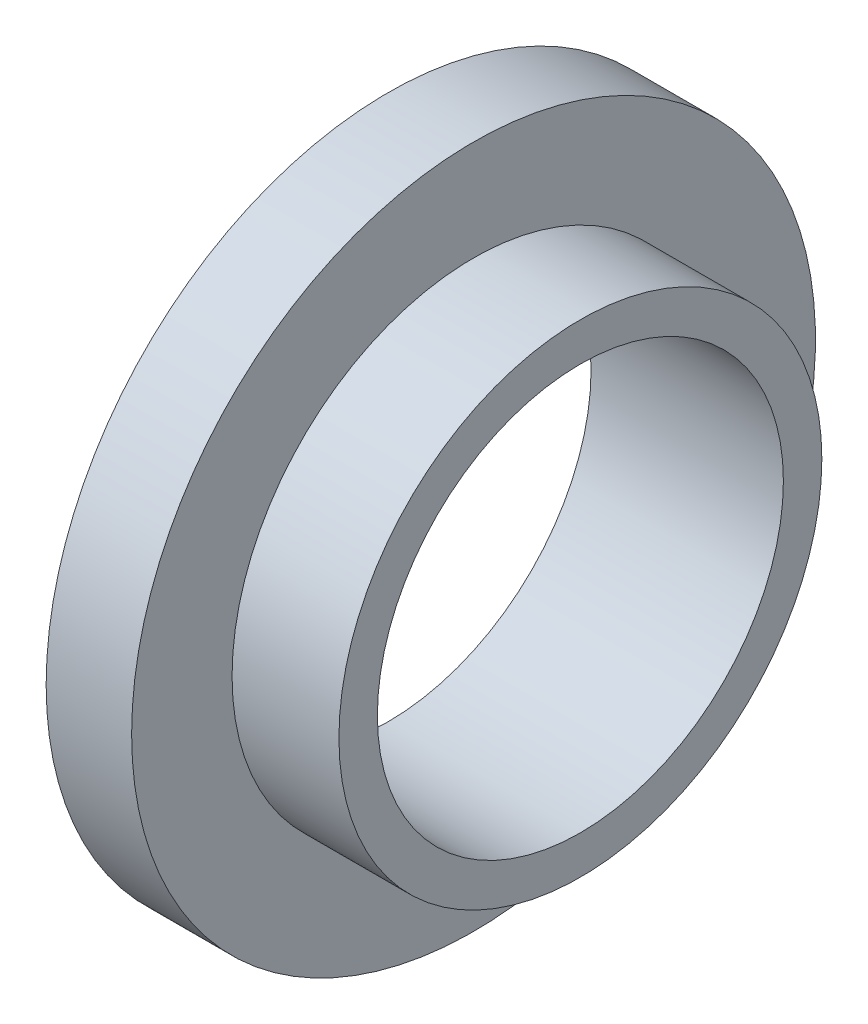
ISO-10303-21;
HEADER;
FILE_DESCRIPTION(('STEP AP214'),'2;1');
FILE_NAME('part.step','',(''),(''),'','','');
FILE_SCHEMA(('AUTOMOTIVE_DESIGN { 1 0 10303 214 1 1 1 1 }'));
ENDSEC;
DATA;
#1=APPLICATION_CONTEXT('core data for automotive mechanical design processes');
#2=APPLICATION_PROTOCOL_DEFINITION('international standard','automotive_design',2000,#1);
#3=PRODUCT_CONTEXT('',#1,'mechanical');
#4=PRODUCT('Part','Part','',(#3));
#5=PRODUCT_RELATED_PRODUCT_CATEGORY('part','',(#4));
#6=PRODUCT_DEFINITION_FORMATION('','',#4);
#7=PRODUCT_DEFINITION_CONTEXT('part definition',#1,'design');
#8=PRODUCT_DEFINITION('design','',#6,#7);
#9=PRODUCT_DEFINITION_SHAPE('','',#8);
#10=(LENGTH_UNIT() NAMED_UNIT(*) SI_UNIT(.MILLI.,.METRE.));
#11=(NAMED_UNIT(*) PLANE_ANGLE_UNIT() SI_UNIT($,.RADIAN.));
#12=(NAMED_UNIT(*) SI_UNIT($,.STERADIAN.) SOLID_ANGLE_UNIT());
#13=UNCERTAINTY_MEASURE_WITH_UNIT(LENGTH_MEASURE(1.E-05),#10,'distance_accuracy_value','');
#14=(GEOMETRIC_REPRESENTATION_CONTEXT(3) GLOBAL_UNCERTAINTY_ASSIGNED_CONTEXT((#13)) GLOBAL_UNIT_ASSIGNED_CONTEXT((#10,
#11,#12)) REPRESENTATION_CONTEXT('',''));
#15=CARTESIAN_POINT('',(0.,0.,0.));
#16=DIRECTION('',(0.,0.,1.));
#17=DIRECTION('',(1.,0.,0.));
#18=AXIS2_PLACEMENT_3D('',#15,#16,#17);
#19=CARTESIAN_POINT('',(45.,0.,0.));
#20=DIRECTION('',(-1.,0.,0.));
#21=DIRECTION('',(0.,0.,1.));
#22=AXIS2_PLACEMENT_3D('',#19,#20,#21);
#23=CYLINDRICAL_SURFACE('',#22,80.);
#24=CARTESIAN_POINT('',(0.,0.,0.));
#25=DIRECTION('',(1.,0.,0.));
#26=DIRECTION('',(0.,0.,-1.));
#27=AXIS2_PLACEMENT_3D('',#24,#25,#26);
#28=CIRCLE('',#27,80.);
#29=CARTESIAN_POINT('',(0.,0.,80.));
#30=VERTEX_POINT('',#29);
#31=EDGE_CURVE('E12',#30,#30,#28,.T.);
#32=CARTESIAN_POINT('',(20.,0.,0.));
#33=DIRECTION('',(1.,0.,0.));
#34=DIRECTION('',(0.,0.,-1.));
#35=AXIS2_PLACEMENT_3D('',#32,#33,#34);
#36=CIRCLE('',#35,80.);
#37=CARTESIAN_POINT('',(20.,0.,80.));
#38=VERTEX_POINT('',#37);
#39=EDGE_CURVE('E40',#38,#38,#36,.T.);
#40=CARTESIAN_POINT('',(0.,0.,80.));
#41=CARTESIAN_POINT('',(0.208333333333327,0.,80.));
#42=CARTESIAN_POINT('',(0.41666666666666,0.,80.));
#43=CARTESIAN_POINT('',(0.833333333333327,0.,80.));
#44=CARTESIAN_POINT('',(1.04166666666666,0.,80.));
#45=CARTESIAN_POINT('',(1.45833333333333,0.,80.));
#46=CARTESIAN_POINT('',(1.66666666666666,0.,80.));
#47=CARTESIAN_POINT('',(2.08333333333333,0.,80.));
#48=CARTESIAN_POINT('',(2.29166666666666,0.,80.));
#49=CARTESIAN_POINT('',(2.70833333333333,0.,80.));
#50=CARTESIAN_POINT('',(2.91666666666666,0.,80.));
#51=CARTESIAN_POINT('',(3.33333333333333,0.,80.));
#52=CARTESIAN_POINT('',(3.54166666666666,0.,80.));
#53=CARTESIAN_POINT('',(3.95833333333333,0.,80.));
#54=CARTESIAN_POINT('',(4.16666666666666,0.,80.));
#55=CARTESIAN_POINT('',(4.58333333333333,0.,80.));
#56=CARTESIAN_POINT('',(4.79166666666666,0.,80.));
#57=CARTESIAN_POINT('',(5.20833333333333,0.,80.));
#58=CARTESIAN_POINT('',(5.41666666666666,0.,80.));
#59=CARTESIAN_POINT('',(5.83333333333333,0.,80.));
#60=CARTESIAN_POINT('',(6.04166666666667,0.,80.));
#61=CARTESIAN_POINT('',(6.45833333333333,0.,80.));
#62=CARTESIAN_POINT('',(6.66666666666667,0.,80.));
#63=CARTESIAN_POINT('',(7.08333333333333,0.,80.));
#64=CARTESIAN_POINT('',(7.29166666666667,0.,80.));
#65=CARTESIAN_POINT('',(7.70833333333333,0.,80.));
#66=CARTESIAN_POINT('',(7.91666666666667,0.,80.));
#67=CARTESIAN_POINT('',(8.33333333333333,0.,80.));
#68=CARTESIAN_POINT('',(8.54166666666667,0.,80.));
#69=CARTESIAN_POINT('',(8.95833333333333,0.,80.));
#70=CARTESIAN_POINT('',(9.16666666666667,0.,80.));
#71=CARTESIAN_POINT('',(9.58333333333333,0.,80.));
#72=CARTESIAN_POINT('',(9.79166666666667,0.,80.));
#73=CARTESIAN_POINT('',(10.2083333333333,0.,80.));
#74=CARTESIAN_POINT('',(10.4166666666667,0.,80.));
#75=CARTESIAN_POINT('',(10.8333333333333,0.,80.));
#76=CARTESIAN_POINT('',(11.0416666666667,0.,80.));
#77=CARTESIAN_POINT('',(11.4583333333333,0.,80.));
#78=CARTESIAN_POINT('',(11.6666666666667,0.,80.));
#79=CARTESIAN_POINT('',(12.0833333333333,0.,80.));
#80=CARTESIAN_POINT('',(12.2916666666667,0.,80.));
#81=CARTESIAN_POINT('',(12.7083333333333,0.,80.));
#82=CARTESIAN_POINT('',(12.9166666666667,0.,80.));
#83=CARTESIAN_POINT('',(13.3333333333333,0.,80.));
#84=CARTESIAN_POINT('',(13.5416666666667,0.,80.));
#85=CARTESIAN_POINT('',(13.9583333333333,0.,80.));
#86=CARTESIAN_POINT('',(14.1666666666667,0.,80.));
#87=CARTESIAN_POINT('',(14.5833333333333,0.,80.));
#88=CARTESIAN_POINT('',(14.7916666666667,0.,80.));
#89=CARTESIAN_POINT('',(15.2083333333333,0.,80.));
#90=CARTESIAN_POINT('',(15.4166666666667,0.,80.));
#91=CARTESIAN_POINT('',(15.8333333333333,0.,80.));
#92=CARTESIAN_POINT('',(16.0416666666667,0.,80.));
#93=CARTESIAN_POINT('',(16.4583333333333,0.,80.));
#94=CARTESIAN_POINT('',(16.6666666666667,0.,80.));
#95=CARTESIAN_POINT('',(17.0833333333333,0.,80.));
#96=CARTESIAN_POINT('',(17.2916666666667,0.,80.));
#97=CARTESIAN_POINT('',(17.7083333333333,0.,80.));
#98=CARTESIAN_POINT('',(17.9166666666667,0.,80.));
#99=CARTESIAN_POINT('',(18.3333333333333,0.,80.));
#100=CARTESIAN_POINT('',(18.5416666666667,0.,80.));
#101=CARTESIAN_POINT('',(18.9583333333333,0.,80.));
#102=CARTESIAN_POINT('',(19.1666666666667,0.,80.));
#103=CARTESIAN_POINT('',(19.5833333333333,0.,80.));
#104=CARTESIAN_POINT('',(19.7916666666667,0.,80.));
#105=CARTESIAN_POINT('',(20.,0.,80.));
#106=B_SPLINE_CURVE_WITH_KNOTS('',3,(#40,#41,#42,#43,#44,#45,#46,#47,#48,#49,#50,#51,#52,#53,
#54,#55,#56,#57,#58,#59,#60,#61,#62,#63,#64,#65,#66,#67,#68,#69,#70,#71,#72,#73,#74,#75,#76,#77,
#78,#79,#80,#81,#82,#83,#84,#85,#86,#87,#88,#89,#90,#91,#92,#93,#94,#95,#96,#97,#98,#99,#100,
#101,#102,#103,#104,#105),.UNSPECIFIED.,.F.,.F.,(4,2,2,2,2,2,2,2,2,2,2,2,2,2,2,2,2,2,2,2,2,2,2,
2,2,2,2,2,2,2,2,2,4),(0.,0.625000000000001,1.25,1.875,2.5,3.125,3.75,4.375,5.,5.62500000000001,
6.25000000000001,6.87500000000001,7.50000000000001,8.12500000000001,8.75000000000001,
9.37500000000001,10.,10.625,11.25,11.875,12.5,13.125,13.75,14.375,15.,15.625,16.25,16.875,17.5,
18.125,18.75,19.375,20.),.UNSPECIFIED.);
#107=EDGE_CURVE('BSEAM37',#30,#38,#106,.T.);
#108=ORIENTED_EDGE('',*,*,#31,.T.);
#109=ORIENTED_EDGE('',*,*,#39,.F.);
#110=ORIENTED_EDGE('',*,*,#107,.T.);
#111=ORIENTED_EDGE('',*,*,#107,.F.);
#112=EDGE_LOOP('',(#108,#110,#109,#111));
#113=FACE_BOUND('',#112,.T.);
#114=ADVANCED_FACE('F37',(#113),#23,.T.);
#115=CARTESIAN_POINT('',(45.,0.,0.));
#116=DIRECTION('',(1.,0.,0.));
#117=DIRECTION('',(0.,0.,-1.));
#118=AXIS2_PLACEMENT_3D('',#115,#116,#117);
#119=PLANE('',#118);
#120=CARTESIAN_POINT('',(45.,0.,0.));
#121=DIRECTION('',(1.,0.,0.));
#122=DIRECTION('',(0.,0.,-1.));
#123=AXIS2_PLACEMENT_3D('',#120,#121,#122);
#124=CIRCLE('',#123,47.5);
#125=CARTESIAN_POINT('',(45.,0.,-47.5));
#126=VERTEX_POINT('',#125);
#127=EDGE_CURVE('E48',#126,#126,#124,.T.);
#128=ORIENTED_EDGE('',*,*,#127,.F.);
#129=EDGE_LOOP('',(#128));
#130=FACE_BOUND('',#129,.T.);
#131=CARTESIAN_POINT('',(45.,0.,0.));
#132=DIRECTION('',(1.,0.,0.));
#133=DIRECTION('',(0.,0.,-1.));
#134=AXIS2_PLACEMENT_3D('',#131,#132,#133);
#135=CIRCLE('',#134,56.5);
#136=CARTESIAN_POINT('',(45.,0.,-56.5));
#137=VERTEX_POINT('',#136);
#138=EDGE_CURVE('E56',#137,#137,#135,.T.);
#139=ORIENTED_EDGE('',*,*,#138,.T.);
#140=EDGE_LOOP('',(#139));
#141=FACE_BOUND('',#140,.T.);
#142=ADVANCED_FACE('F60',(#130,#141),#119,.T.);
#143=CARTESIAN_POINT('',(0.,0.,0.));
#144=DIRECTION('',(1.,0.,0.));
#145=DIRECTION('',(0.,0.,-1.));
#146=AXIS2_PLACEMENT_3D('',#143,#144,#145);
#147=PLANE('',#146);
#148=CARTESIAN_POINT('',(0.,0.,0.));
#149=DIRECTION('',(1.,0.,0.));
#150=DIRECTION('',(0.,0.,-1.));
#151=AXIS2_PLACEMENT_3D('',#148,#149,#150);
#152=CIRCLE('',#151,47.5);
#153=CARTESIAN_POINT('',(0.,0.,-47.5));
#154=VERTEX_POINT('',#153);
#155=EDGE_CURVE('E44',#154,#154,#152,.T.);
#156=ORIENTED_EDGE('',*,*,#155,.T.);
#157=EDGE_LOOP('',(#156));
#158=FACE_BOUND('',#157,.T.);
#159=ORIENTED_EDGE('',*,*,#31,.F.);
#160=EDGE_LOOP('',(#159));
#161=FACE_BOUND('',#160,.T.);
#162=ADVANCED_FACE('F79',(#158,#161),#147,.F.);
#163=CARTESIAN_POINT('',(0.,0.,0.));
#164=DIRECTION('',(1.,0.,0.));
#165=DIRECTION('',(0.,0.,-1.));
#166=AXIS2_PLACEMENT_3D('',#163,#164,#165);
#167=CYLINDRICAL_SURFACE('',#166,47.5);
#168=CARTESIAN_POINT('',(0.,0.,-47.5));
#169=CARTESIAN_POINT('',(0.468749999999999,0.,-47.5));
#170=CARTESIAN_POINT('',(0.9375,0.,-47.5));
#171=CARTESIAN_POINT('',(1.875,0.,-47.5));
#172=CARTESIAN_POINT('',(2.34375,0.,-47.5));
#173=CARTESIAN_POINT('',(3.28125,0.,-47.5));
#174=CARTESIAN_POINT('',(3.75,0.,-47.5));
#175=CARTESIAN_POINT('',(4.6875,0.,-47.5));
#176=CARTESIAN_POINT('',(5.15625,0.,-47.5));
#177=CARTESIAN_POINT('',(6.09375,0.,-47.5));
#178=CARTESIAN_POINT('',(6.5625,0.,-47.5));
#179=CARTESIAN_POINT('',(7.5,0.,-47.5));
#180=CARTESIAN_POINT('',(7.96875,0.,-47.5));
#181=CARTESIAN_POINT('',(8.90625,0.,-47.5));
#182=CARTESIAN_POINT('',(9.375,0.,-47.5));
#183=CARTESIAN_POINT('',(10.3125,0.,-47.5));
#184=CARTESIAN_POINT('',(10.78125,0.,-47.5));
#185=CARTESIAN_POINT('',(11.71875,0.,-47.5));
#186=CARTESIAN_POINT('',(12.1875,0.,-47.5));
#187=CARTESIAN_POINT('',(13.125,0.,-47.5));
#188=CARTESIAN_POINT('',(13.59375,0.,-47.5));
#189=CARTESIAN_POINT('',(14.53125,0.,-47.5));
#190=CARTESIAN_POINT('',(15.,0.,-47.5));
#191=CARTESIAN_POINT('',(15.9375,0.,-47.5));
#192=CARTESIAN_POINT('',(16.40625,0.,-47.5));
#193=CARTESIAN_POINT('',(17.34375,0.,-47.5));
#194=CARTESIAN_POINT('',(17.8125,0.,-47.5));
#195=CARTESIAN_POINT('',(18.75,0.,-47.5));
#196=CARTESIAN_POINT('',(19.21875,0.,-47.5));
#197=CARTESIAN_POINT('',(20.15625,0.,-47.5));
#198=CARTESIAN_POINT('',(20.625,0.,-47.5));
#199=CARTESIAN_POINT('',(21.5625,0.,-47.5));
#200=CARTESIAN_POINT('',(22.03125,0.,-47.5));
#201=CARTESIAN_POINT('',(22.96875,0.,-47.5));
#202=CARTESIAN_POINT('',(23.4375,0.,-47.5));
#203=CARTESIAN_POINT('',(24.375,0.,-47.5));
#204=CARTESIAN_POINT('',(24.84375,0.,-47.5));
#205=CARTESIAN_POINT('',(25.78125,0.,-47.5));
#206=CARTESIAN_POINT('',(26.25,0.,-47.5));
#207=CARTESIAN_POINT('',(27.1875,0.,-47.5));
#208=CARTESIAN_POINT('',(27.65625,0.,-47.5));
#209=CARTESIAN_POINT('',(28.59375,0.,-47.5));
#210=CARTESIAN_POINT('',(29.0625,0.,-47.5));
#211=CARTESIAN_POINT('',(30.,0.,-47.5));
#212=CARTESIAN_POINT('',(30.46875,0.,-47.5));
#213=CARTESIAN_POINT('',(31.40625,0.,-47.5));
#214=CARTESIAN_POINT('',(31.875,0.,-47.5));
#215=CARTESIAN_POINT('',(32.8125,0.,-47.5));
#216=CARTESIAN_POINT('',(33.28125,0.,-47.5));
#217=CARTESIAN_POINT('',(34.21875,0.,-47.5));
#218=CARTESIAN_POINT('',(34.6875,0.,-47.5));
#219=CARTESIAN_POINT('',(35.625,0.,-47.5));
#220=CARTESIAN_POINT('',(36.09375,0.,-47.5));
#221=CARTESIAN_POINT('',(37.03125,0.,-47.5));
#222=CARTESIAN_POINT('',(37.5,0.,-47.5));
#223=CARTESIAN_POINT('',(38.4375,0.,-47.5));
#224=CARTESIAN_POINT('',(38.90625,0.,-47.5));
#225=CARTESIAN_POINT('',(39.84375,0.,-47.5));
#226=CARTESIAN_POINT('',(40.3125,0.,-47.5));
#227=CARTESIAN_POINT('',(41.25,0.,-47.5));
#228=CARTESIAN_POINT('',(41.71875,0.,-47.5));
#229=CARTESIAN_POINT('',(42.65625,0.,-47.5));
#230=CARTESIAN_POINT('',(43.125,0.,-47.5));
#231=CARTESIAN_POINT('',(44.0625,0.,-47.5));
#232=CARTESIAN_POINT('',(44.53125,0.,-47.5));
#233=CARTESIAN_POINT('',(45.,0.,-47.5));
#234=B_SPLINE_CURVE_WITH_KNOTS('',3,(#168,#169,#170,#171,#172,#173,#174,#175,#176,#177,#178,
#179,#180,#181,#182,#183,#184,#185,#186,#187,#188,#189,#190,#191,#192,#193,#194,#195,#196,#197,
#198,#199,#200,#201,#202,#203,#204,#205,#206,#207,#208,#209,#210,#211,#212,#213,#214,#215,#216,
#217,#218,#219,#220,#221,#222,#223,#224,#225,#226,#227,#228,#229,#230,#231,#232,#233),
.UNSPECIFIED.,.F.,.F.,(4,2,2,2,2,2,2,2,2,2,2,2,2,2,2,2,2,2,2,2,2,2,2,2,2,2,2,2,2,2,2,2,4),(0.,
1.40625,2.8125,4.21875,5.625,7.03125,8.4375,9.84375,11.25,12.65625,14.0625,15.46875,16.875,
18.28125,19.6875,21.09375,22.5,23.90625,25.3125,26.71875,28.125,29.53125,30.9375,32.34375,33.75,
35.15625,36.5625,37.96875,39.375,40.78125,42.1875,43.59375,45.),.UNSPECIFIED.);
#235=EDGE_CURVE('BSEAM70',#154,#126,#234,.T.);
#236=ORIENTED_EDGE('',*,*,#155,.F.);
#237=ORIENTED_EDGE('',*,*,#127,.T.);
#238=ORIENTED_EDGE('',*,*,#235,.T.);
#239=ORIENTED_EDGE('',*,*,#235,.F.);
#240=EDGE_LOOP('',(#236,#238,#237,#239));
#241=FACE_BOUND('',#240,.T.);
#242=ADVANCED_FACE('F70',(#241),#167,.F.);
#243=CARTESIAN_POINT('',(20.,0.,0.));
#244=DIRECTION('',(1.,0.,0.));
#245=DIRECTION('',(0.,0.,-1.));
#246=AXIS2_PLACEMENT_3D('',#243,#244,#245);
#247=PLANE('',#246);
#248=CARTESIAN_POINT('',(20.,0.,0.));
#249=DIRECTION('',(1.,0.,0.));
#250=DIRECTION('',(0.,0.,-1.));
#251=AXIS2_PLACEMENT_3D('',#248,#249,#250);
#252=CIRCLE('',#251,56.5);
#253=CARTESIAN_POINT('',(20.,0.,-56.5));
#254=VERTEX_POINT('',#253);
#255=EDGE_CURVE('E53',#254,#254,#252,.F.);
#256=ORIENTED_EDGE('',*,*,#255,.T.);
#257=EDGE_LOOP('',(#256));
#258=FACE_BOUND('',#257,.T.);
#259=ORIENTED_EDGE('',*,*,#39,.T.);
#260=EDGE_LOOP('',(#259));
#261=FACE_BOUND('',#260,.T.);
#262=ADVANCED_FACE('F64',(#258,#261),#247,.T.);
#263=CARTESIAN_POINT('',(-228.536911679492,0.,0.));
#264=DIRECTION('',(1.,0.,0.));
#265=DIRECTION('',(0.,0.,-1.));
#266=AXIS2_PLACEMENT_3D('',#263,#264,#265);
#267=CYLINDRICAL_SURFACE('',#266,56.5);
#268=ORIENTED_EDGE('',*,*,#255,.F.);
#269=EDGE_LOOP('',(#268));
#270=FACE_BOUND('',#269,.T.);
#271=ORIENTED_EDGE('',*,*,#138,.F.);
#272=EDGE_LOOP('',(#271));
#273=FACE_BOUND('',#272,.T.);
#274=ADVANCED_FACE('F62',(#270,#273),#267,.T.);
#275=CLOSED_SHELL('',(#114,#142,#162,#242,#262,#274));
#276=MANIFOLD_SOLID_BREP('B2',#275);
#277=ADVANCED_BREP_SHAPE_REPRESENTATION('',(#18,#276),#14);
#278=SHAPE_DEFINITION_REPRESENTATION(#9,#277);
ENDSEC;
END-ISO-10303-21;
